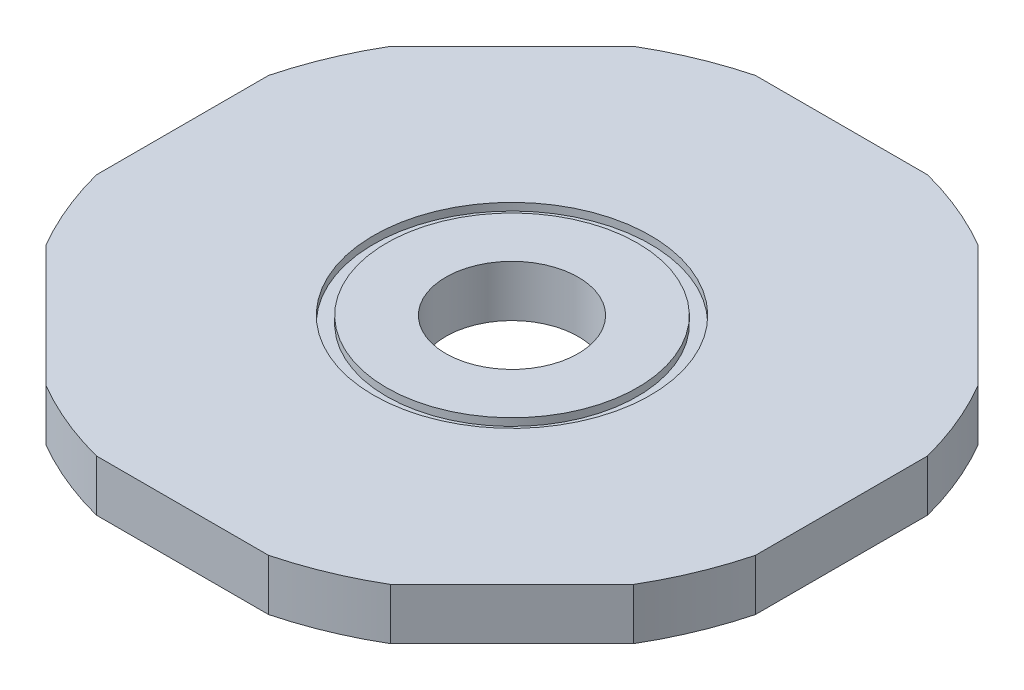
ISO-10303-21;
HEADER;
FILE_DESCRIPTION(('STEP AP214'),'2;1');
FILE_NAME('part.step','',(''),(''),'','','');
FILE_SCHEMA(('AUTOMOTIVE_DESIGN { 1 0 10303 214 1 1 1 1 }'));
ENDSEC;
DATA;
#1=APPLICATION_CONTEXT('core data for automotive mechanical design processes');
#2=APPLICATION_PROTOCOL_DEFINITION('international standard','automotive_design',2000,#1);
#3=PRODUCT_CONTEXT('',#1,'mechanical');
#4=PRODUCT('Part','Part','',(#3));
#5=PRODUCT_RELATED_PRODUCT_CATEGORY('part','',(#4));
#6=PRODUCT_DEFINITION_FORMATION('','',#4);
#7=PRODUCT_DEFINITION_CONTEXT('part definition',#1,'design');
#8=PRODUCT_DEFINITION('design','',#6,#7);
#9=PRODUCT_DEFINITION_SHAPE('','',#8);
#10=(LENGTH_UNIT() NAMED_UNIT(*) SI_UNIT(.MILLI.,.METRE.));
#11=(NAMED_UNIT(*) PLANE_ANGLE_UNIT() SI_UNIT($,.RADIAN.));
#12=(NAMED_UNIT(*) SI_UNIT($,.STERADIAN.) SOLID_ANGLE_UNIT());
#13=UNCERTAINTY_MEASURE_WITH_UNIT(LENGTH_MEASURE(1.E-05),#10,'distance_accuracy_value','');
#14=(GEOMETRIC_REPRESENTATION_CONTEXT(3) GLOBAL_UNCERTAINTY_ASSIGNED_CONTEXT((#13)) GLOBAL_UNIT_ASSIGNED_CONTEXT((#10,
#11,#12)) REPRESENTATION_CONTEXT('',''));
#15=CARTESIAN_POINT('',(0.,0.,0.));
#16=DIRECTION('',(0.,0.,1.));
#17=DIRECTION('',(1.,0.,0.));
#18=AXIS2_PLACEMENT_3D('',#15,#16,#17);
#19=CARTESIAN_POINT('',(0.,19.05,0.));
#20=DIRECTION('',(0.,1.,0.));
#21=DIRECTION('',(0.,0.,1.));
#22=AXIS2_PLACEMENT_3D('',#19,#20,#21);
#23=PLANE('',#22);
#24=CARTESIAN_POINT('',(0.,19.05,0.));
#25=DIRECTION('',(0.,1.,0.));
#26=DIRECTION('',(0.,0.,1.));
#27=AXIS2_PLACEMENT_3D('',#24,#25,#26);
#28=CIRCLE('',#27,24.5745);
#29=CARTESIAN_POINT('',(0.,19.05,24.5745));
#30=VERTEX_POINT('',#29);
#31=EDGE_CURVE('E336',#30,#30,#28,.T.);
#32=ORIENTED_EDGE('',*,*,#31,.F.);
#33=EDGE_LOOP('',(#32));
#34=FACE_BOUND('',#33,.T.);
#35=CARTESIAN_POINT('',(0.,19.05,0.));
#36=DIRECTION('',(0.,1.,0.));
#37=DIRECTION('',(0.,0.,1.));
#38=AXIS2_PLACEMENT_3D('',#35,#36,#37);
#39=CIRCLE('',#38,46.5455);
#40=CARTESIAN_POINT('',(0.,19.05,46.5455));
#41=VERTEX_POINT('',#40);
#42=EDGE_CURVE('E320',#41,#41,#39,.T.);
#43=ORIENTED_EDGE('',*,*,#42,.T.);
#44=EDGE_LOOP('',(#43));
#45=FACE_BOUND('',#44,.T.);
#46=ADVANCED_FACE('F49',(#34,#45),#23,.T.);
#47=CARTESIAN_POINT('',(0.,19.05,122.3));
#48=DIRECTION('',(0.,0.,-1.));
#49=DIRECTION('',(-1.,0.,0.));
#50=AXIS2_PLACEMENT_3D('',#47,#48,#49);
#51=PLANE('',#50);
#52=DIRECTION('',(1.,0.,0.));
#53=VECTOR('',#52,1.);
#54=CARTESIAN_POINT('',(0.,0.,122.3));
#55=LINE('',#54,#53);
#56=CARTESIAN_POINT('',(-31.9322720770069,0.,122.3));
#57=VERTEX_POINT('',#56);
#58=CARTESIAN_POINT('',(31.9322720770068,0.,122.3));
#59=VERTEX_POINT('',#58);
#60=EDGE_CURVE('E204',#57,#59,#55,.T.);
#61=ORIENTED_EDGE('',*,*,#60,.T.);
#62=DIRECTION('',(0.,-1.,0.));
#63=VECTOR('',#62,1.);
#64=CARTESIAN_POINT('',(31.9322720770068,19.05,122.3));
#65=LINE('',#64,#63);
#66=CARTESIAN_POINT('',(31.9322720770068,19.05,122.3));
#67=VERTEX_POINT('',#66);
#68=EDGE_CURVE('E11',#67,#59,#65,.T.);
#69=ORIENTED_EDGE('',*,*,#68,.F.);
#70=DIRECTION('',(1.,0.,0.));
#71=VECTOR('',#70,1.);
#72=CARTESIAN_POINT('',(0.,19.05,122.3));
#73=LINE('',#72,#71);
#74=CARTESIAN_POINT('',(-31.9322720770069,19.05,122.3));
#75=VERTEX_POINT('',#74);
#76=EDGE_CURVE('E346',#75,#67,#73,.T.);
#77=ORIENTED_EDGE('',*,*,#76,.F.);
#78=DIRECTION('',(0.,-1.,0.));
#79=VECTOR('',#78,1.);
#80=CARTESIAN_POINT('',(-31.9322720770069,19.05,122.3));
#81=LINE('',#80,#79);
#82=EDGE_CURVE('E200',#75,#57,#81,.T.);
#83=ORIENTED_EDGE('',*,*,#82,.T.);
#84=EDGE_LOOP('',(#61,#69,#77,#83));
#85=FACE_BOUND('',#84,.T.);
#86=ADVANCED_FACE('F51',(#85),#51,.F.);
#87=CARTESIAN_POINT('',(0.,19.05,0.));
#88=DIRECTION('',(0.,-1.,0.));
#89=DIRECTION('',(0.,0.,-1.));
#90=AXIS2_PLACEMENT_3D('',#87,#88,#89);
#91=CYLINDRICAL_SURFACE('',#90,126.4);
#92=CARTESIAN_POINT('',(0.,0.,0.));
#93=DIRECTION('',(0.,1.,0.));
#94=DIRECTION('',(0.,0.,1.));
#95=AXIS2_PLACEMENT_3D('',#92,#93,#94);
#96=CIRCLE('',#95,126.4);
#97=CARTESIAN_POINT('',(63.8996332147694,0.,109.05868546346));
#98=VERTEX_POINT('',#97);
#99=EDGE_CURVE('E208',#59,#98,#96,.T.);
#100=ORIENTED_EDGE('',*,*,#99,.T.);
#101=DIRECTION('',(0.,-1.,0.));
#102=VECTOR('',#101,1.);
#103=CARTESIAN_POINT('',(63.8996332147694,19.05,109.05868546346));
#104=LINE('',#103,#102);
#105=CARTESIAN_POINT('',(63.8996332147694,19.05,109.05868546346));
#106=VERTEX_POINT('',#105);
#107=EDGE_CURVE('E60',#106,#98,#104,.T.);
#108=ORIENTED_EDGE('',*,*,#107,.F.);
#109=CARTESIAN_POINT('',(0.,19.05,0.));
#110=DIRECTION('',(0.,1.,0.));
#111=DIRECTION('',(0.,0.,1.));
#112=AXIS2_PLACEMENT_3D('',#109,#110,#111);
#113=CIRCLE('',#112,126.4);
#114=EDGE_CURVE('E137',#67,#106,#113,.T.);
#115=ORIENTED_EDGE('',*,*,#114,.F.);
#116=ORIENTED_EDGE('',*,*,#68,.T.);
#117=EDGE_LOOP('',(#100,#108,#115,#116));
#118=FACE_BOUND('',#117,.T.);
#119=ADVANCED_FACE('F440',(#118),#91,.T.);
#120=CARTESIAN_POINT('',(86.4791593391148,19.05,86.4791593391148));
#121=DIRECTION('',(-0.707106781186548,0.,-0.707106781186548));
#122=DIRECTION('',(-0.707106781186548,0.,0.707106781186548));
#123=AXIS2_PLACEMENT_3D('',#120,#121,#122);
#124=PLANE('',#123);
#125=DIRECTION('',(0.707106781186548,0.,-0.707106781186548));
#126=VECTOR('',#125,1.);
#127=CARTESIAN_POINT('',(86.4791593391148,0.,86.4791593391148));
#128=LINE('',#127,#126);
#129=CARTESIAN_POINT('',(109.05868546346,0.,63.8996332147694));
#130=VERTEX_POINT('',#129);
#131=EDGE_CURVE('E212',#98,#130,#128,.T.);
#132=ORIENTED_EDGE('',*,*,#131,.T.);
#133=DIRECTION('',(0.,-1.,0.));
#134=VECTOR('',#133,1.);
#135=CARTESIAN_POINT('',(109.05868546346,19.05,63.8996332147694));
#136=LINE('',#135,#134);
#137=CARTESIAN_POINT('',(109.05868546346,19.05,63.8996332147694));
#138=VERTEX_POINT('',#137);
#139=EDGE_CURVE('E279',#138,#130,#136,.T.);
#140=ORIENTED_EDGE('',*,*,#139,.F.);
#141=DIRECTION('',(0.707106781186548,0.,-0.707106781186548));
#142=VECTOR('',#141,1.);
#143=CARTESIAN_POINT('',(86.4791593391148,19.05,86.4791593391148));
#144=LINE('',#143,#142);
#145=EDGE_CURVE('E350',#106,#138,#144,.T.);
#146=ORIENTED_EDGE('',*,*,#145,.F.);
#147=ORIENTED_EDGE('',*,*,#107,.T.);
#148=EDGE_LOOP('',(#132,#140,#146,#147));
#149=FACE_BOUND('',#148,.T.);
#150=ADVANCED_FACE('F450',(#149),#124,.F.);
#151=CARTESIAN_POINT('',(122.3,0.,31.9322720770069));
#152=VERTEX_POINT('',#151);
#153=EDGE_CURVE('E213',#130,#152,#96,.T.);
#154=ORIENTED_EDGE('',*,*,#153,.T.);
#155=DIRECTION('',(0.,-1.,0.));
#156=VECTOR('',#155,1.);
#157=CARTESIAN_POINT('',(122.3,19.05,31.9322720770069));
#158=LINE('',#157,#156);
#159=CARTESIAN_POINT('',(122.3,19.05,31.9322720770069));
#160=VERTEX_POINT('',#159);
#161=EDGE_CURVE('E275',#160,#152,#158,.T.);
#162=ORIENTED_EDGE('',*,*,#161,.F.);
#163=EDGE_CURVE('E351',#138,#160,#113,.T.);
#164=ORIENTED_EDGE('',*,*,#163,.F.);
#165=ORIENTED_EDGE('',*,*,#139,.T.);
#166=EDGE_LOOP('',(#154,#162,#164,#165));
#167=FACE_BOUND('',#166,.T.);
#168=ADVANCED_FACE('F387',(#167),#91,.T.);
#169=CARTESIAN_POINT('',(122.3,19.05,0.));
#170=DIRECTION('',(-1.,0.,0.));
#171=DIRECTION('',(0.,0.,1.));
#172=AXIS2_PLACEMENT_3D('',#169,#170,#171);
#173=PLANE('',#172);
#174=DIRECTION('',(0.,0.,-1.));
#175=VECTOR('',#174,1.);
#176=CARTESIAN_POINT('',(122.3,0.,0.));
#177=LINE('',#176,#175);
#178=CARTESIAN_POINT('',(122.3,0.,-31.9322720770068));
#179=VERTEX_POINT('',#178);
#180=EDGE_CURVE('E216',#152,#179,#177,.T.);
#181=ORIENTED_EDGE('',*,*,#180,.T.);
#182=DIRECTION('',(0.,-1.,0.));
#183=VECTOR('',#182,1.);
#184=CARTESIAN_POINT('',(122.3,19.05,-31.9322720770068));
#185=LINE('',#184,#183);
#186=CARTESIAN_POINT('',(122.3,19.05,-31.9322720770068));
#187=VERTEX_POINT('',#186);
#188=EDGE_CURVE('E271',#187,#179,#185,.T.);
#189=ORIENTED_EDGE('',*,*,#188,.F.);
#190=DIRECTION('',(0.,0.,-1.));
#191=VECTOR('',#190,1.);
#192=CARTESIAN_POINT('',(122.3,19.05,0.));
#193=LINE('',#192,#191);
#194=EDGE_CURVE('E354',#160,#187,#193,.T.);
#195=ORIENTED_EDGE('',*,*,#194,.F.);
#196=ORIENTED_EDGE('',*,*,#161,.T.);
#197=EDGE_LOOP('',(#181,#189,#195,#196));
#198=FACE_BOUND('',#197,.T.);
#199=ADVANCED_FACE('F391',(#198),#173,.F.);
#200=CARTESIAN_POINT('',(109.05868546346,0.,-63.8996332147692));
#201=VERTEX_POINT('',#200);
#202=EDGE_CURVE('E219',#179,#201,#96,.T.);
#203=ORIENTED_EDGE('',*,*,#202,.T.);
#204=DIRECTION('',(0.,-1.,0.));
#205=VECTOR('',#204,1.);
#206=CARTESIAN_POINT('',(109.05868546346,19.05,-63.8996332147692));
#207=LINE('',#206,#205);
#208=CARTESIAN_POINT('',(109.05868546346,19.05,-63.8996332147692));
#209=VERTEX_POINT('',#208);
#210=EDGE_CURVE('E267',#209,#201,#207,.T.);
#211=ORIENTED_EDGE('',*,*,#210,.F.);
#212=EDGE_CURVE('E357',#187,#209,#113,.T.);
#213=ORIENTED_EDGE('',*,*,#212,.F.);
#214=ORIENTED_EDGE('',*,*,#188,.T.);
#215=EDGE_LOOP('',(#203,#211,#213,#214));
#216=FACE_BOUND('',#215,.T.);
#217=ADVANCED_FACE('F394',(#216),#91,.T.);
#218=CARTESIAN_POINT('',(86.4791593391147,19.05,-86.4791593391147));
#219=DIRECTION('',(-0.707106781186548,0.,0.707106781186548));
#220=DIRECTION('',(0.707106781186548,0.,0.707106781186548));
#221=AXIS2_PLACEMENT_3D('',#218,#219,#220);
#222=PLANE('',#221);
#223=DIRECTION('',(-0.707106781186548,0.,-0.707106781186548));
#224=VECTOR('',#223,1.);
#225=CARTESIAN_POINT('',(86.4791593391147,0.,-86.4791593391147));
#226=LINE('',#225,#224);
#227=CARTESIAN_POINT('',(63.8996332147692,0.,-109.05868546346));
#228=VERTEX_POINT('',#227);
#229=EDGE_CURVE('E220',#201,#228,#226,.T.);
#230=ORIENTED_EDGE('',*,*,#229,.T.);
#231=DIRECTION('',(0.,-1.,0.));
#232=VECTOR('',#231,1.);
#233=CARTESIAN_POINT('',(63.8996332147692,19.05,-109.05868546346));
#234=LINE('',#233,#232);
#235=CARTESIAN_POINT('',(63.8996332147692,19.05,-109.05868546346));
#236=VERTEX_POINT('',#235);
#237=EDGE_CURVE('E263',#236,#228,#234,.T.);
#238=ORIENTED_EDGE('',*,*,#237,.F.);
#239=DIRECTION('',(-0.707106781186548,0.,-0.707106781186548));
#240=VECTOR('',#239,1.);
#241=CARTESIAN_POINT('',(86.4791593391147,19.05,-86.4791593391147));
#242=LINE('',#241,#240);
#243=EDGE_CURVE('E358',#209,#236,#242,.T.);
#244=ORIENTED_EDGE('',*,*,#243,.F.);
#245=ORIENTED_EDGE('',*,*,#210,.T.);
#246=EDGE_LOOP('',(#230,#238,#244,#245));
#247=FACE_BOUND('',#246,.T.);
#248=ADVANCED_FACE('F399',(#247),#222,.F.);
#249=CARTESIAN_POINT('',(31.932272077007,0.,-122.3));
#250=VERTEX_POINT('',#249);
#251=EDGE_CURVE('E223',#228,#250,#96,.T.);
#252=ORIENTED_EDGE('',*,*,#251,.T.);
#253=DIRECTION('',(0.,-1.,0.));
#254=VECTOR('',#253,1.);
#255=CARTESIAN_POINT('',(31.932272077007,19.05,-122.3));
#256=LINE('',#255,#254);
#257=CARTESIAN_POINT('',(31.932272077007,19.05,-122.3));
#258=VERTEX_POINT('',#257);
#259=EDGE_CURVE('E259',#258,#250,#256,.T.);
#260=ORIENTED_EDGE('',*,*,#259,.F.);
#261=EDGE_CURVE('E361',#236,#258,#113,.T.);
#262=ORIENTED_EDGE('',*,*,#261,.F.);
#263=ORIENTED_EDGE('',*,*,#237,.T.);
#264=EDGE_LOOP('',(#252,#260,#262,#263));
#265=FACE_BOUND('',#264,.T.);
#266=ADVANCED_FACE('F402',(#265),#91,.T.);
#267=CARTESIAN_POINT('',(0.,19.05,-122.3));
#268=DIRECTION('',(0.,0.,1.));
#269=DIRECTION('',(1.,0.,0.));
#270=AXIS2_PLACEMENT_3D('',#267,#268,#269);
#271=PLANE('',#270);
#272=DIRECTION('',(-1.,0.,0.));
#273=VECTOR('',#272,1.);
#274=CARTESIAN_POINT('',(0.,0.,-122.3));
#275=LINE('',#274,#273);
#276=CARTESIAN_POINT('',(-31.932272077007,0.,-122.3));
#277=VERTEX_POINT('',#276);
#278=EDGE_CURVE('E224',#250,#277,#275,.T.);
#279=ORIENTED_EDGE('',*,*,#278,.T.);
#280=DIRECTION('',(0.,-1.,0.));
#281=VECTOR('',#280,1.);
#282=CARTESIAN_POINT('',(-31.932272077007,19.05,-122.3));
#283=LINE('',#282,#281);
#284=CARTESIAN_POINT('',(-31.932272077007,19.05,-122.3));
#285=VERTEX_POINT('',#284);
#286=EDGE_CURVE('E255',#285,#277,#283,.T.);
#287=ORIENTED_EDGE('',*,*,#286,.F.);
#288=DIRECTION('',(-1.,0.,0.));
#289=VECTOR('',#288,1.);
#290=CARTESIAN_POINT('',(0.,19.05,-122.3));
#291=LINE('',#290,#289);
#292=EDGE_CURVE('E362',#258,#285,#291,.T.);
#293=ORIENTED_EDGE('',*,*,#292,.F.);
#294=ORIENTED_EDGE('',*,*,#259,.T.);
#295=EDGE_LOOP('',(#279,#287,#293,#294));
#296=FACE_BOUND('',#295,.T.);
#297=ADVANCED_FACE('F407',(#296),#271,.F.);
#298=CARTESIAN_POINT('',(-63.8996332147692,0.,-109.05868546346));
#299=VERTEX_POINT('',#298);
#300=EDGE_CURVE('E227',#277,#299,#96,.T.);
#301=ORIENTED_EDGE('',*,*,#300,.T.);
#302=DIRECTION('',(0.,-1.,0.));
#303=VECTOR('',#302,1.);
#304=CARTESIAN_POINT('',(-63.8996332147692,19.05,-109.05868546346));
#305=LINE('',#304,#303);
#306=CARTESIAN_POINT('',(-63.8996332147692,19.05,-109.05868546346));
#307=VERTEX_POINT('',#306);
#308=EDGE_CURVE('E251',#307,#299,#305,.T.);
#309=ORIENTED_EDGE('',*,*,#308,.F.);
#310=EDGE_CURVE('E364',#285,#307,#113,.T.);
#311=ORIENTED_EDGE('',*,*,#310,.F.);
#312=ORIENTED_EDGE('',*,*,#286,.T.);
#313=EDGE_LOOP('',(#301,#309,#311,#312));
#314=FACE_BOUND('',#313,.T.);
#315=ADVANCED_FACE('F410',(#314),#91,.T.);
#316=CARTESIAN_POINT('',(-86.4791593391147,19.05,-86.4791593391147));
#317=DIRECTION('',(0.707106781186548,0.,0.707106781186548));
#318=DIRECTION('',(0.707106781186548,0.,-0.707106781186548));
#319=AXIS2_PLACEMENT_3D('',#316,#317,#318);
#320=PLANE('',#319);
#321=DIRECTION('',(-0.707106781186548,0.,0.707106781186548));
#322=VECTOR('',#321,1.);
#323=CARTESIAN_POINT('',(-86.4791593391147,0.,-86.4791593391147));
#324=LINE('',#323,#322);
#325=CARTESIAN_POINT('',(-109.05868546346,0.,-63.8996332147692));
#326=VERTEX_POINT('',#325);
#327=EDGE_CURVE('E228',#299,#326,#324,.T.);
#328=ORIENTED_EDGE('',*,*,#327,.T.);
#329=DIRECTION('',(0.,-1.,0.));
#330=VECTOR('',#329,1.);
#331=CARTESIAN_POINT('',(-109.05868546346,19.05,-63.8996332147692));
#332=LINE('',#331,#330);
#333=CARTESIAN_POINT('',(-109.05868546346,19.05,-63.8996332147692));
#334=VERTEX_POINT('',#333);
#335=EDGE_CURVE('E247',#334,#326,#332,.T.);
#336=ORIENTED_EDGE('',*,*,#335,.F.);
#337=DIRECTION('',(-0.707106781186548,0.,0.707106781186548));
#338=VECTOR('',#337,1.);
#339=CARTESIAN_POINT('',(-86.4791593391147,19.05,-86.4791593391147));
#340=LINE('',#339,#338);
#341=EDGE_CURVE('E365',#307,#334,#340,.T.);
#342=ORIENTED_EDGE('',*,*,#341,.F.);
#343=ORIENTED_EDGE('',*,*,#308,.T.);
#344=EDGE_LOOP('',(#328,#336,#342,#343));
#345=FACE_BOUND('',#344,.T.);
#346=ADVANCED_FACE('F413',(#345),#320,.F.);
#347=CARTESIAN_POINT('',(-122.3,0.,-31.932272077007));
#348=VERTEX_POINT('',#347);
#349=EDGE_CURVE('E231',#326,#348,#96,.T.);
#350=ORIENTED_EDGE('',*,*,#349,.T.);
#351=DIRECTION('',(0.,-1.,0.));
#352=VECTOR('',#351,1.);
#353=CARTESIAN_POINT('',(-122.3,19.05,-31.932272077007));
#354=LINE('',#353,#352);
#355=CARTESIAN_POINT('',(-122.3,19.05,-31.932272077007));
#356=VERTEX_POINT('',#355);
#357=EDGE_CURVE('E243',#356,#348,#354,.T.);
#358=ORIENTED_EDGE('',*,*,#357,.F.);
#359=EDGE_CURVE('E187',#334,#356,#113,.T.);
#360=ORIENTED_EDGE('',*,*,#359,.F.);
#361=ORIENTED_EDGE('',*,*,#335,.T.);
#362=EDGE_LOOP('',(#350,#358,#360,#361));
#363=FACE_BOUND('',#362,.T.);
#364=ADVANCED_FACE('F418',(#363),#91,.T.);
#365=CARTESIAN_POINT('',(-122.3,19.05,0.));
#366=DIRECTION('',(1.,0.,0.));
#367=DIRECTION('',(0.,0.,-1.));
#368=AXIS2_PLACEMENT_3D('',#365,#366,#367);
#369=PLANE('',#368);
#370=DIRECTION('',(0.,0.,1.));
#371=VECTOR('',#370,1.);
#372=CARTESIAN_POINT('',(-122.3,0.,0.));
#373=LINE('',#372,#371);
#374=CARTESIAN_POINT('',(-122.3,0.,31.932272077007));
#375=VERTEX_POINT('',#374);
#376=EDGE_CURVE('E232',#348,#375,#373,.T.);
#377=ORIENTED_EDGE('',*,*,#376,.T.);
#378=DIRECTION('',(0.,-1.,0.));
#379=VECTOR('',#378,1.);
#380=CARTESIAN_POINT('',(-122.3,19.05,31.932272077007));
#381=LINE('',#380,#379);
#382=CARTESIAN_POINT('',(-122.3,19.05,31.932272077007));
#383=VERTEX_POINT('',#382);
#384=EDGE_CURVE('E193',#383,#375,#381,.T.);
#385=ORIENTED_EDGE('',*,*,#384,.F.);
#386=DIRECTION('',(0.,0.,1.));
#387=VECTOR('',#386,1.);
#388=CARTESIAN_POINT('',(-122.3,19.05,0.));
#389=LINE('',#388,#387);
#390=EDGE_CURVE('E181',#356,#383,#389,.T.);
#391=ORIENTED_EDGE('',*,*,#390,.F.);
#392=ORIENTED_EDGE('',*,*,#357,.T.);
#393=EDGE_LOOP('',(#377,#385,#391,#392));
#394=FACE_BOUND('',#393,.T.);
#395=ADVANCED_FACE('F421',(#394),#369,.F.);
#396=CARTESIAN_POINT('',(-109.05868546346,0.,63.8996332147692));
#397=VERTEX_POINT('',#396);
#398=EDGE_CURVE('E191',#375,#397,#96,.T.);
#399=ORIENTED_EDGE('',*,*,#398,.T.);
#400=DIRECTION('',(0.,-1.,0.));
#401=VECTOR('',#400,1.);
#402=CARTESIAN_POINT('',(-109.05868546346,19.05,63.8996332147692));
#403=LINE('',#402,#401);
#404=CARTESIAN_POINT('',(-109.05868546346,19.05,63.8996332147692));
#405=VERTEX_POINT('',#404);
#406=EDGE_CURVE('E188',#405,#397,#403,.T.);
#407=ORIENTED_EDGE('',*,*,#406,.F.);
#408=EDGE_CURVE('E175',#383,#405,#113,.T.);
#409=ORIENTED_EDGE('',*,*,#408,.F.);
#410=ORIENTED_EDGE('',*,*,#384,.T.);
#411=EDGE_LOOP('',(#399,#407,#409,#410));
#412=FACE_BOUND('',#411,.T.);
#413=ADVANCED_FACE('F189',(#412),#91,.T.);
#414=CARTESIAN_POINT('',(-86.4791593391147,19.05,86.4791593391147));
#415=DIRECTION('',(0.707106781186548,0.,-0.707106781186548));
#416=DIRECTION('',(-0.707106781186548,0.,-0.707106781186548));
#417=AXIS2_PLACEMENT_3D('',#414,#415,#416);
#418=PLANE('',#417);
#419=DIRECTION('',(0.707106781186548,0.,0.707106781186548));
#420=VECTOR('',#419,1.);
#421=CARTESIAN_POINT('',(-86.4791593391147,0.,86.4791593391147));
#422=LINE('',#421,#420);
#423=CARTESIAN_POINT('',(-63.8996332147692,0.,109.05868546346));
#424=VERTEX_POINT('',#423);
#425=EDGE_CURVE('E123',#397,#424,#422,.T.);
#426=ORIENTED_EDGE('',*,*,#425,.T.);
#427=DIRECTION('',(0.,-1.,0.));
#428=VECTOR('',#427,1.);
#429=CARTESIAN_POINT('',(-63.8996332147692,19.05,109.05868546346));
#430=LINE('',#429,#428);
#431=CARTESIAN_POINT('',(-63.8996332147692,19.05,109.05868546346));
#432=VERTEX_POINT('',#431);
#433=EDGE_CURVE('E194',#432,#424,#430,.T.);
#434=ORIENTED_EDGE('',*,*,#433,.F.);
#435=DIRECTION('',(0.707106781186548,0.,0.707106781186548));
#436=VECTOR('',#435,1.);
#437=CARTESIAN_POINT('',(-86.4791593391147,19.05,86.4791593391147));
#438=LINE('',#437,#436);
#439=EDGE_CURVE('E179',#405,#432,#438,.T.);
#440=ORIENTED_EDGE('',*,*,#439,.F.);
#441=ORIENTED_EDGE('',*,*,#406,.T.);
#442=EDGE_LOOP('',(#426,#434,#440,#441));
#443=FACE_BOUND('',#442,.T.);
#444=ADVANCED_FACE('F196',(#443),#418,.F.);
#445=EDGE_CURVE('E129',#424,#57,#96,.T.);
#446=ORIENTED_EDGE('',*,*,#445,.T.);
#447=ORIENTED_EDGE('',*,*,#82,.F.);
#448=EDGE_CURVE('E69',#432,#75,#113,.T.);
#449=ORIENTED_EDGE('',*,*,#448,.F.);
#450=ORIENTED_EDGE('',*,*,#433,.T.);
#451=EDGE_LOOP('',(#446,#447,#449,#450));
#452=FACE_BOUND('',#451,.T.);
#453=ADVANCED_FACE('F437',(#452),#91,.T.);
#454=CARTESIAN_POINT('',(0.,19.05,0.));
#455=DIRECTION('',(0.,1.,0.));
#456=DIRECTION('',(0.,0.,1.));
#457=AXIS2_PLACEMENT_3D('',#454,#455,#456);
#458=CIRCLE('',#457,51.3715);
#459=CARTESIAN_POINT('',(0.,19.05,51.3715));
#460=VERTEX_POINT('',#459);
#461=EDGE_CURVE('E328',#460,#460,#458,.T.);
#462=ORIENTED_EDGE('',*,*,#461,.F.);
#463=EDGE_LOOP('',(#462));
#464=FACE_BOUND('',#463,.T.);
#465=ORIENTED_EDGE('',*,*,#76,.T.);
#466=ORIENTED_EDGE('',*,*,#114,.T.);
#467=ORIENTED_EDGE('',*,*,#145,.T.);
#468=ORIENTED_EDGE('',*,*,#163,.T.);
#469=ORIENTED_EDGE('',*,*,#194,.T.);
#470=ORIENTED_EDGE('',*,*,#212,.T.);
#471=ORIENTED_EDGE('',*,*,#243,.T.);
#472=ORIENTED_EDGE('',*,*,#261,.T.);
#473=ORIENTED_EDGE('',*,*,#292,.T.);
#474=ORIENTED_EDGE('',*,*,#310,.T.);
#475=ORIENTED_EDGE('',*,*,#341,.T.);
#476=ORIENTED_EDGE('',*,*,#359,.T.);
#477=ORIENTED_EDGE('',*,*,#390,.T.);
#478=ORIENTED_EDGE('',*,*,#408,.T.);
#479=ORIENTED_EDGE('',*,*,#439,.T.);
#480=ORIENTED_EDGE('',*,*,#448,.T.);
#481=EDGE_LOOP('',(#465,#466,#467,#468,#469,#470,#471,#472,#473,#474,#475,#476,#477,#478,#479,#480));
#482=FACE_BOUND('',#481,.T.);
#483=ADVANCED_FACE('F177',(#464,#482),#23,.T.);
#484=CARTESIAN_POINT('',(0.,0.,0.));
#485=DIRECTION('',(0.,1.,0.));
#486=DIRECTION('',(0.,0.,1.));
#487=AXIS2_PLACEMENT_3D('',#484,#485,#486);
#488=PLANE('',#487);
#489=CARTESIAN_POINT('',(2.4920098907859E-13,0.,-71.374));
#490=DIRECTION('',(0.,-1.,0.));
#491=DIRECTION('',(1.,0.,0.));
#492=AXIS2_PLACEMENT_3D('',#489,#490,#491);
#493=CIRCLE('',#492,4.00000000000001);
#494=CARTESIAN_POINT('',(4.00000000000025,0.,-71.374));
#495=VERTEX_POINT('',#494);
#496=EDGE_CURVE('E472',#495,#495,#493,.T.);
#497=ORIENTED_EDGE('',*,*,#496,.F.);
#498=EDGE_LOOP('',(#497));
#499=FACE_BOUND('',#498,.T.);
#500=CARTESIAN_POINT('',(50.4690394004089,0.,-50.4690394004084));
#501=DIRECTION('',(0.,-1.,0.));
#502=DIRECTION('',(0.707106781186544,0.,0.707106781186551));
#503=AXIS2_PLACEMENT_3D('',#500,#501,#502);
#504=CIRCLE('',#503,4.00000000000001);
#505=CARTESIAN_POINT('',(53.2974665251551,0.,-47.6406122756622));
#506=VERTEX_POINT('',#505);
#507=EDGE_CURVE('E476',#506,#506,#504,.T.);
#508=ORIENTED_EDGE('',*,*,#507,.F.);
#509=EDGE_LOOP('',(#508));
#510=FACE_BOUND('',#509,.T.);
#511=CARTESIAN_POINT('',(50.4690394004082,0.,50.4690394004091));
#512=DIRECTION('',(0.,-1.,0.));
#513=DIRECTION('',(-0.707106781186554,0.,0.707106781186541));
#514=AXIS2_PLACEMENT_3D('',#511,#512,#513);
#515=CIRCLE('',#514,4.00000000000001);
#516=CARTESIAN_POINT('',(47.640612275662,0.,53.2974665251552));
#517=VERTEX_POINT('',#516);
#518=EDGE_CURVE('E305',#517,#517,#515,.T.);
#519=ORIENTED_EDGE('',*,*,#518,.F.);
#520=EDGE_LOOP('',(#519));
#521=FACE_BOUND('',#520,.T.);
#522=CARTESIAN_POINT('',(-7.47602967235769E-13,0.,71.374));
#523=DIRECTION('',(0.,-1.,0.));
#524=DIRECTION('',(-1.,0.,0.));
#525=AXIS2_PLACEMENT_3D('',#522,#523,#524);
#526=CIRCLE('',#525,4.00000000000001);
#527=CARTESIAN_POINT('',(-4.00000000000075,0.,71.374));
#528=VERTEX_POINT('',#527);
#529=EDGE_CURVE('E483',#528,#528,#526,.T.);
#530=ORIENTED_EDGE('',*,*,#529,.F.);
#531=EDGE_LOOP('',(#530));
#532=FACE_BOUND('',#531,.T.);
#533=CARTESIAN_POINT('',(-50.4690394004093,0.,50.469039400408));
#534=DIRECTION('',(0.,-1.,0.));
#535=DIRECTION('',(-0.707106781186539,0.,-0.707106781186556));
#536=AXIS2_PLACEMENT_3D('',#533,#534,#535);
#537=CIRCLE('',#536,4.00000000000001);
#538=CARTESIAN_POINT('',(-53.2974665251554,0.,47.6406122756618));
#539=VERTEX_POINT('',#538);
#540=EDGE_CURVE('E487',#539,#539,#537,.T.);
#541=ORIENTED_EDGE('',*,*,#540,.F.);
#542=EDGE_LOOP('',(#541));
#543=FACE_BOUND('',#542,.T.);
#544=CARTESIAN_POINT('',(-50.4690394004086,0.,-50.4690394004087));
#545=DIRECTION('',(0.,-1.,0.));
#546=DIRECTION('',(0.707106781186549,0.,-0.707106781186546));
#547=AXIS2_PLACEMENT_3D('',#544,#545,#546);
#548=CIRCLE('',#547,4.00000000000001);
#549=CARTESIAN_POINT('',(-47.6406122756624,0.,-53.2974665251549));
#550=VERTEX_POINT('',#549);
#551=EDGE_CURVE('E296',#550,#550,#548,.T.);
#552=ORIENTED_EDGE('',*,*,#551,.F.);
#553=EDGE_LOOP('',(#552));
#554=FACE_BOUND('',#553,.T.);
#555=CARTESIAN_POINT('',(71.374,0.,0.));
#556=DIRECTION('',(0.,-1.,0.));
#557=DIRECTION('',(0.,0.,-1.));
#558=AXIS2_PLACEMENT_3D('',#555,#556,#557);
#559=CIRCLE('',#558,4.025);
#560=CARTESIAN_POINT('',(71.374,0.,-4.025));
#561=VERTEX_POINT('',#560);
#562=EDGE_CURVE('E294',#561,#561,#559,.T.);
#563=ORIENTED_EDGE('',*,*,#562,.F.);
#564=EDGE_LOOP('',(#563));
#565=FACE_BOUND('',#564,.T.);
#566=CARTESIAN_POINT('',(-71.374,0.,0.));
#567=DIRECTION('',(0.,-1.,0.));
#568=DIRECTION('',(0.,0.,-1.));
#569=AXIS2_PLACEMENT_3D('',#566,#567,#568);
#570=CIRCLE('',#569,4.00000000000001);
#571=CARTESIAN_POINT('',(-71.374,0.,-4.00000000000001));
#572=VERTEX_POINT('',#571);
#573=EDGE_CURVE('E315',#572,#572,#570,.T.);
#574=ORIENTED_EDGE('',*,*,#573,.F.);
#575=EDGE_LOOP('',(#574));
#576=FACE_BOUND('',#575,.T.);
#577=CARTESIAN_POINT('',(0.,0.,0.));
#578=DIRECTION('',(0.,1.,0.));
#579=DIRECTION('',(0.,0.,1.));
#580=AXIS2_PLACEMENT_3D('',#577,#578,#579);
#581=CIRCLE('',#580,24.5745);
#582=CARTESIAN_POINT('',(0.,0.,24.5745));
#583=VERTEX_POINT('',#582);
#584=EDGE_CURVE('E209',#583,#583,#581,.T.);
#585=ORIENTED_EDGE('',*,*,#584,.T.);
#586=EDGE_LOOP('',(#585));
#587=FACE_BOUND('',#586,.T.);
#588=ORIENTED_EDGE('',*,*,#60,.F.);
#589=ORIENTED_EDGE('',*,*,#445,.F.);
#590=ORIENTED_EDGE('',*,*,#425,.F.);
#591=ORIENTED_EDGE('',*,*,#398,.F.);
#592=ORIENTED_EDGE('',*,*,#376,.F.);
#593=ORIENTED_EDGE('',*,*,#349,.F.);
#594=ORIENTED_EDGE('',*,*,#327,.F.);
#595=ORIENTED_EDGE('',*,*,#300,.F.);
#596=ORIENTED_EDGE('',*,*,#278,.F.);
#597=ORIENTED_EDGE('',*,*,#251,.F.);
#598=ORIENTED_EDGE('',*,*,#229,.F.);
#599=ORIENTED_EDGE('',*,*,#202,.F.);
#600=ORIENTED_EDGE('',*,*,#180,.F.);
#601=ORIENTED_EDGE('',*,*,#153,.F.);
#602=ORIENTED_EDGE('',*,*,#131,.F.);
#603=ORIENTED_EDGE('',*,*,#99,.F.);
#604=EDGE_LOOP('',(#588,#589,#590,#591,#592,#593,#594,#595,#596,#597,#598,#599,#600,#601,#602,#603));
#605=FACE_BOUND('',#604,.T.);
#606=ADVANCED_FACE('F425',(#499,#510,#521,#532,#543,#554,#565,#576,#587,#605),#488,.F.);
#607=CARTESIAN_POINT('',(0.,0.,0.));
#608=DIRECTION('',(0.,1.,0.));
#609=DIRECTION('',(0.,0.,1.));
#610=AXIS2_PLACEMENT_3D('',#607,#608,#609);
#611=CYLINDRICAL_SURFACE('',#610,24.5745);
#612=CARTESIAN_POINT('',(0.,0.,24.5745));
#613=CARTESIAN_POINT('',(0.,0.1984375,24.5745));
#614=CARTESIAN_POINT('',(0.,0.396875,24.5745));
#615=CARTESIAN_POINT('',(0.,0.79375,24.5745));
#616=CARTESIAN_POINT('',(0.,0.9921875,24.5745));
#617=CARTESIAN_POINT('',(0.,1.3890625,24.5745));
#618=CARTESIAN_POINT('',(0.,1.5875,24.5745));
#619=CARTESIAN_POINT('',(0.,1.984375,24.5745));
#620=CARTESIAN_POINT('',(0.,2.1828125,24.5745));
#621=CARTESIAN_POINT('',(0.,2.5796875,24.5745));
#622=CARTESIAN_POINT('',(0.,2.778125,24.5745));
#623=CARTESIAN_POINT('',(0.,3.175,24.5745));
#624=CARTESIAN_POINT('',(0.,3.3734375,24.5745));
#625=CARTESIAN_POINT('',(0.,3.7703125,24.5745));
#626=CARTESIAN_POINT('',(0.,3.96875,24.5745));
#627=CARTESIAN_POINT('',(0.,4.365625,24.5745));
#628=CARTESIAN_POINT('',(0.,4.5640625,24.5745));
#629=CARTESIAN_POINT('',(0.,4.9609375,24.5745));
#630=CARTESIAN_POINT('',(0.,5.159375,24.5745));
#631=CARTESIAN_POINT('',(0.,5.55625,24.5745));
#632=CARTESIAN_POINT('',(0.,5.7546875,24.5745));
#633=CARTESIAN_POINT('',(0.,6.1515625,24.5745));
#634=CARTESIAN_POINT('',(0.,6.35,24.5745));
#635=CARTESIAN_POINT('',(0.,6.746875,24.5745));
#636=CARTESIAN_POINT('',(0.,6.9453125,24.5745));
#637=CARTESIAN_POINT('',(0.,7.3421875,24.5745));
#638=CARTESIAN_POINT('',(0.,7.540625,24.5745));
#639=CARTESIAN_POINT('',(0.,7.9375,24.5745));
#640=CARTESIAN_POINT('',(0.,8.1359375,24.5745));
#641=CARTESIAN_POINT('',(0.,8.5328125,24.5745));
#642=CARTESIAN_POINT('',(0.,8.73125,24.5745));
#643=CARTESIAN_POINT('',(0.,9.128125,24.5745));
#644=CARTESIAN_POINT('',(0.,9.3265625,24.5745));
#645=CARTESIAN_POINT('',(0.,9.7234375,24.5745));
#646=CARTESIAN_POINT('',(0.,9.921875,24.5745));
#647=CARTESIAN_POINT('',(0.,10.31875,24.5745));
#648=CARTESIAN_POINT('',(0.,10.5171875,24.5745));
#649=CARTESIAN_POINT('',(0.,10.9140625,24.5745));
#650=CARTESIAN_POINT('',(0.,11.1125,24.5745));
#651=CARTESIAN_POINT('',(0.,11.509375,24.5745));
#652=CARTESIAN_POINT('',(0.,11.7078125,24.5745));
#653=CARTESIAN_POINT('',(0.,12.1046875,24.5745));
#654=CARTESIAN_POINT('',(0.,12.303125,24.5745));
#655=CARTESIAN_POINT('',(0.,12.7,24.5745));
#656=CARTESIAN_POINT('',(0.,12.8984375,24.5745));
#657=CARTESIAN_POINT('',(0.,13.2953125,24.5745));
#658=CARTESIAN_POINT('',(0.,13.49375,24.5745));
#659=CARTESIAN_POINT('',(0.,13.890625,24.5745));
#660=CARTESIAN_POINT('',(0.,14.0890625,24.5745));
#661=CARTESIAN_POINT('',(0.,14.4859375,24.5745));
#662=CARTESIAN_POINT('',(0.,14.684375,24.5745));
#663=CARTESIAN_POINT('',(0.,15.08125,24.5745));
#664=CARTESIAN_POINT('',(0.,15.2796875,24.5745));
#665=CARTESIAN_POINT('',(0.,15.6765625,24.5745));
#666=CARTESIAN_POINT('',(0.,15.875,24.5745));
#667=CARTESIAN_POINT('',(0.,16.271875,24.5745));
#668=CARTESIAN_POINT('',(0.,16.4703125,24.5745));
#669=CARTESIAN_POINT('',(0.,16.8671875,24.5745));
#670=CARTESIAN_POINT('',(0.,17.065625,24.5745));
#671=CARTESIAN_POINT('',(0.,17.4625,24.5745));
#672=CARTESIAN_POINT('',(0.,17.6609375,24.5745));
#673=CARTESIAN_POINT('',(0.,18.0578125,24.5745));
#674=CARTESIAN_POINT('',(0.,18.25625,24.5745));
#675=CARTESIAN_POINT('',(0.,18.653125,24.5745));
#676=CARTESIAN_POINT('',(0.,18.8515625,24.5745));
#677=CARTESIAN_POINT('',(0.,19.05,24.5745));
#678=B_SPLINE_CURVE_WITH_KNOTS('',3,(#612,#613,#614,#615,#616,#617,#618,#619,#620,#621,#622,
#623,#624,#625,#626,#627,#628,#629,#630,#631,#632,#633,#634,#635,#636,#637,#638,#639,#640,#641,
#642,#643,#644,#645,#646,#647,#648,#649,#650,#651,#652,#653,#654,#655,#656,#657,#658,#659,#660,
#661,#662,#663,#664,#665,#666,#667,#668,#669,#670,#671,#672,#673,#674,#675,#676,#677),
.UNSPECIFIED.,.F.,.F.,(4,2,2,2,2,2,2,2,2,2,2,2,2,2,2,2,2,2,2,2,2,2,2,2,2,2,2,2,2,2,2,2,4),(0.,
0.5953125,1.190625,1.7859375,2.38125,2.9765625,3.571875,4.1671875,4.7625,5.3578125,5.953125,
6.5484375,7.14375,7.7390625,8.334375,8.9296875,9.525,10.1203125,10.715625,11.3109375,11.90625,
12.5015625,13.096875,13.6921875,14.2875,14.8828125,15.478125,16.0734375,16.66875,17.2640625,
17.859375,18.4546875,19.05),.UNSPECIFIED.);
#679=EDGE_CURVE('BSEAM460',#583,#30,#678,.T.);
#680=ORIENTED_EDGE('',*,*,#584,.F.);
#681=ORIENTED_EDGE('',*,*,#31,.T.);
#682=ORIENTED_EDGE('',*,*,#679,.T.);
#683=ORIENTED_EDGE('',*,*,#679,.F.);
#684=EDGE_LOOP('',(#680,#682,#681,#683));
#685=FACE_BOUND('',#684,.T.);
#686=ADVANCED_FACE('F460',(#685),#611,.F.);
#687=CARTESIAN_POINT('',(0.,16.256,0.));
#688=DIRECTION('',(0.,1.,0.));
#689=DIRECTION('',(0.,0.,1.));
#690=AXIS2_PLACEMENT_3D('',#687,#688,#689);
#691=CYLINDRICAL_SURFACE('',#690,51.3715);
#692=CARTESIAN_POINT('',(0.,16.256,0.));
#693=DIRECTION('',(0.,1.,0.));
#694=DIRECTION('',(0.,0.,1.));
#695=AXIS2_PLACEMENT_3D('',#692,#693,#694);
#696=CIRCLE('',#695,51.3715);
#697=CARTESIAN_POINT('',(0.,16.256,51.3715));
#698=VERTEX_POINT('',#697);
#699=EDGE_CURVE('E332',#698,#698,#696,.T.);
#700=ORIENTED_EDGE('',*,*,#699,.F.);
#701=EDGE_LOOP('',(#700));
#702=FACE_BOUND('',#701,.T.);
#703=ORIENTED_EDGE('',*,*,#461,.T.);
#704=EDGE_LOOP('',(#703));
#705=FACE_BOUND('',#704,.T.);
#706=ADVANCED_FACE('F467',(#702,#705),#691,.F.);
#707=CARTESIAN_POINT('',(0.,16.256,0.));
#708=DIRECTION('',(0.,1.,0.));
#709=DIRECTION('',(0.,0.,1.));
#710=AXIS2_PLACEMENT_3D('',#707,#708,#709);
#711=PLANE('',#710);
#712=CARTESIAN_POINT('',(0.,16.256,0.));
#713=DIRECTION('',(0.,1.,0.));
#714=DIRECTION('',(0.,0.,1.));
#715=AXIS2_PLACEMENT_3D('',#712,#713,#714);
#716=CIRCLE('',#715,46.5455);
#717=CARTESIAN_POINT('',(0.,16.256,46.5455));
#718=VERTEX_POINT('',#717);
#719=EDGE_CURVE('E324',#718,#718,#716,.T.);
#720=ORIENTED_EDGE('',*,*,#719,.F.);
#721=EDGE_LOOP('',(#720));
#722=FACE_BOUND('',#721,.T.);
#723=ORIENTED_EDGE('',*,*,#699,.T.);
#724=EDGE_LOOP('',(#723));
#725=FACE_BOUND('',#724,.T.);
#726=ADVANCED_FACE('F510',(#722,#725),#711,.T.);
#727=CARTESIAN_POINT('',(0.,16.256,0.));
#728=DIRECTION('',(0.,1.,0.));
#729=DIRECTION('',(0.,0.,1.));
#730=AXIS2_PLACEMENT_3D('',#727,#728,#729);
#731=CYLINDRICAL_SURFACE('',#730,46.5455);
#732=ORIENTED_EDGE('',*,*,#719,.T.);
#733=EDGE_LOOP('',(#732));
#734=FACE_BOUND('',#733,.T.);
#735=ORIENTED_EDGE('',*,*,#42,.F.);
#736=EDGE_LOOP('',(#735));
#737=FACE_BOUND('',#736,.T.);
#738=ADVANCED_FACE('F500',(#734,#737),#731,.T.);
#739=CARTESIAN_POINT('',(-71.374,12.7,0.));
#740=DIRECTION('',(0.,-1.,0.));
#741=DIRECTION('',(0.,0.,-1.));
#742=AXIS2_PLACEMENT_3D('',#739,#740,#741);
#743=CYLINDRICAL_SURFACE('',#742,4.00000000000001);
#744=CARTESIAN_POINT('',(-71.374,12.7,0.));
#745=DIRECTION('',(0.,-1.,0.));
#746=DIRECTION('',(0.,0.,-1.));
#747=AXIS2_PLACEMENT_3D('',#744,#745,#746);
#748=CIRCLE('',#747,4.00000000000001);
#749=CARTESIAN_POINT('',(-71.374,12.7,-4.00000000000001));
#750=VERTEX_POINT('',#749);
#751=EDGE_CURVE('E316',#750,#750,#748,.T.);
#752=ORIENTED_EDGE('',*,*,#751,.F.);
#753=EDGE_LOOP('',(#752));
#754=FACE_BOUND('',#753,.T.);
#755=ORIENTED_EDGE('',*,*,#573,.T.);
#756=EDGE_LOOP('',(#755));
#757=FACE_BOUND('',#756,.T.);
#758=ADVANCED_FACE('F497',(#754,#757),#743,.F.);
#759=CARTESIAN_POINT('',(-71.374,12.7,0.));
#760=DIRECTION('',(0.,-1.,0.));
#761=DIRECTION('',(0.,0.,-1.));
#762=AXIS2_PLACEMENT_3D('',#759,#760,#761);
#763=PLANE('',#762);
#764=ORIENTED_EDGE('',*,*,#751,.T.);
#765=EDGE_LOOP('',(#764));
#766=FACE_BOUND('',#765,.T.);
#767=ADVANCED_FACE('F499',(#766),#763,.T.);
#768=CARTESIAN_POINT('',(71.374,0.,0.));
#769=DIRECTION('',(0.,-1.,0.));
#770=DIRECTION('',(0.,0.,-1.));
#771=AXIS2_PLACEMENT_3D('',#768,#769,#770);
#772=CONICAL_SURFACE('',#771,4.025,0.785398163397444);
#773=CARTESIAN_POINT('',(71.374,0.0249999999999931,0.));
#774=DIRECTION('',(0.,-1.,0.));
#775=DIRECTION('',(0.,0.,-1.));
#776=AXIS2_PLACEMENT_3D('',#773,#774,#775);
#777=CIRCLE('',#776,4.00000000000001);
#778=CARTESIAN_POINT('',(71.374,0.0249999999999931,-4.00000000000001));
#779=VERTEX_POINT('',#778);
#780=EDGE_CURVE('E285',#779,#779,#777,.F.);
#781=ORIENTED_EDGE('',*,*,#780,.T.);
#782=EDGE_LOOP('',(#781));
#783=FACE_BOUND('',#782,.T.);
#784=ORIENTED_EDGE('',*,*,#562,.T.);
#785=EDGE_LOOP('',(#784));
#786=FACE_BOUND('',#785,.T.);
#787=ADVANCED_FACE('F507',(#783,#786),#772,.F.);
#788=CARTESIAN_POINT('',(71.374,12.7,0.));
#789=DIRECTION('',(0.,-1.,0.));
#790=DIRECTION('',(0.,0.,1.));
#791=AXIS2_PLACEMENT_3D('',#788,#789,#790);
#792=PLANE('',#791);
#793=CARTESIAN_POINT('',(71.374,12.7,0.));
#794=DIRECTION('',(0.,-1.,0.));
#795=DIRECTION('',(0.,0.,1.));
#796=AXIS2_PLACEMENT_3D('',#793,#794,#795);
#797=CIRCLE('',#796,4.00000000000001);
#798=CARTESIAN_POINT('',(71.374,12.7,4.00000000000001));
#799=VERTEX_POINT('',#798);
#800=EDGE_CURVE('E773',#799,#799,#797,.T.);
#801=ORIENTED_EDGE('',*,*,#800,.T.);
#802=EDGE_LOOP('',(#801));
#803=FACE_BOUND('',#802,.T.);
#804=CARTESIAN_POINT('',(71.374,12.7,0.));
#805=DIRECTION('',(0.,-1.,0.));
#806=DIRECTION('',(0.,0.,-1.));
#807=AXIS2_PLACEMENT_3D('',#804,#805,#806);
#808=CIRCLE('',#807,3.4);
#809=CARTESIAN_POINT('',(71.374,12.7,-3.4));
#810=VERTEX_POINT('',#809);
#811=EDGE_CURVE('E53',#810,#810,#808,.F.);
#812=ORIENTED_EDGE('',*,*,#811,.T.);
#813=EDGE_LOOP('',(#812));
#814=FACE_BOUND('',#813,.T.);
#815=ADVANCED_FACE('F578',(#803,#814),#792,.T.);
#816=CARTESIAN_POINT('',(71.374,12.7,0.));
#817=DIRECTION('',(0.,-1.,0.));
#818=DIRECTION('',(0.,0.,-1.));
#819=AXIS2_PLACEMENT_3D('',#816,#817,#818);
#820=CYLINDRICAL_SURFACE('',#819,4.00000000000001);
#821=ORIENTED_EDGE('',*,*,#800,.F.);
#822=EDGE_LOOP('',(#821));
#823=FACE_BOUND('',#822,.T.);
#824=ORIENTED_EDGE('',*,*,#780,.F.);
#825=EDGE_LOOP('',(#824));
#826=FACE_BOUND('',#825,.T.);
#827=ADVANCED_FACE('F561',(#823,#826),#820,.F.);
#828=CARTESIAN_POINT('',(71.374,13.9570672953063,0.));
#829=DIRECTION('',(0.,-1.,0.));
#830=DIRECTION('',(0.,0.,-1.));
#831=AXIS2_PLACEMENT_3D('',#828,#829,#830);
#832=CONICAL_SURFACE('',#831,3.4,1.02974425867666);
#833=CARTESIAN_POINT('',(71.374,15.9999934,0.));
#834=VERTEX_POINT('',#833);
#835=VERTEX_LOOP('',#834);
#836=FACE_BOUND('',#835,.T.);
#837=CARTESIAN_POINT('',(71.374,13.9570672953063,0.));
#838=DIRECTION('',(0.,-1.,0.));
#839=DIRECTION('',(0.,0.,-1.));
#840=AXIS2_PLACEMENT_3D('',#837,#838,#839);
#841=CIRCLE('',#840,3.4);
#842=CARTESIAN_POINT('',(71.374,13.9570672953063,-3.4));
#843=VERTEX_POINT('',#842);
#844=EDGE_CURVE('E311',#843,#843,#841,.T.);
#845=ORIENTED_EDGE('',*,*,#844,.T.);
#846=EDGE_LOOP('',(#845));
#847=FACE_BOUND('',#846,.T.);
#848=ADVANCED_FACE('F557',(#836,#847),#832,.F.);
#849=CARTESIAN_POINT('',(71.374,0.,0.));
#850=DIRECTION('',(0.,-1.,0.));
#851=DIRECTION('',(0.,0.,-1.));
#852=AXIS2_PLACEMENT_3D('',#849,#850,#851);
#853=CYLINDRICAL_SURFACE('',#852,3.4);
#854=ORIENTED_EDGE('',*,*,#844,.F.);
#855=EDGE_LOOP('',(#854));
#856=FACE_BOUND('',#855,.T.);
#857=ORIENTED_EDGE('',*,*,#811,.F.);
#858=EDGE_LOOP('',(#857));
#859=FACE_BOUND('',#858,.T.);
#860=ADVANCED_FACE('F560',(#856,#859),#853,.F.);
#861=CARTESIAN_POINT('',(-50.4690394004086,12.7,-50.4690394004087));
#862=DIRECTION('',(0.,-1.,0.));
#863=DIRECTION('',(0.,0.,-1.));
#864=AXIS2_PLACEMENT_3D('',#861,#862,#863);
#865=CYLINDRICAL_SURFACE('',#864,4.00000000000001);
#866=CARTESIAN_POINT('',(-50.4690394004086,12.7,-50.4690394004087));
#867=DIRECTION('',(0.,-1.,0.));
#868=DIRECTION('',(0.707106781186549,0.,-0.707106781186546));
#869=AXIS2_PLACEMENT_3D('',#866,#867,#868);
#870=CIRCLE('',#869,4.00000000000001);
#871=CARTESIAN_POINT('',(-47.6406122756624,12.7,-53.2974665251549));
#872=VERTEX_POINT('',#871);
#873=EDGE_CURVE('E288',#872,#872,#870,.T.);
#874=ORIENTED_EDGE('',*,*,#873,.F.);
#875=EDGE_LOOP('',(#874));
#876=FACE_BOUND('',#875,.T.);
#877=ORIENTED_EDGE('',*,*,#551,.T.);
#878=EDGE_LOOP('',(#877));
#879=FACE_BOUND('',#878,.T.);
#880=ADVANCED_FACE('F610',(#876,#879),#865,.F.);
#881=CARTESIAN_POINT('',(-50.4690394004086,12.7,-50.4690394004087));
#882=DIRECTION('',(0.,-1.,0.));
#883=DIRECTION('',(0.707106781186549,0.,-0.707106781186546));
#884=AXIS2_PLACEMENT_3D('',#881,#882,#883);
#885=PLANE('',#884);
#886=ORIENTED_EDGE('',*,*,#873,.T.);
#887=EDGE_LOOP('',(#886));
#888=FACE_BOUND('',#887,.T.);
#889=ADVANCED_FACE('F619',(#888),#885,.T.);
#890=CARTESIAN_POINT('',(-50.4690394004093,12.7,50.469039400408));
#891=DIRECTION('',(0.,-1.,0.));
#892=DIRECTION('',(0.,0.,-1.));
#893=AXIS2_PLACEMENT_3D('',#890,#891,#892);
#894=CYLINDRICAL_SURFACE('',#893,4.00000000000001);
#895=CARTESIAN_POINT('',(-50.4690394004093,12.7,50.469039400408));
#896=DIRECTION('',(0.,-1.,0.));
#897=DIRECTION('',(-0.707106781186539,0.,-0.707106781186556));
#898=AXIS2_PLACEMENT_3D('',#895,#896,#897);
#899=CIRCLE('',#898,4.00000000000001);
#900=CARTESIAN_POINT('',(-53.2974665251554,12.7,47.6406122756618));
#901=VERTEX_POINT('',#900);
#902=EDGE_CURVE('E788',#901,#901,#899,.T.);
#903=ORIENTED_EDGE('',*,*,#902,.F.);
#904=EDGE_LOOP('',(#903));
#905=FACE_BOUND('',#904,.T.);
#906=ORIENTED_EDGE('',*,*,#540,.T.);
#907=EDGE_LOOP('',(#906));
#908=FACE_BOUND('',#907,.T.);
#909=ADVANCED_FACE('F630',(#905,#908),#894,.F.);
#910=CARTESIAN_POINT('',(-50.4690394004093,12.7,50.469039400408));
#911=DIRECTION('',(0.,-1.,0.));
#912=DIRECTION('',(-0.707106781186539,0.,-0.707106781186556));
#913=AXIS2_PLACEMENT_3D('',#910,#911,#912);
#914=PLANE('',#913);
#915=ORIENTED_EDGE('',*,*,#902,.T.);
#916=EDGE_LOOP('',(#915));
#917=FACE_BOUND('',#916,.T.);
#918=ADVANCED_FACE('F640',(#917),#914,.T.);
#919=CARTESIAN_POINT('',(-7.47602967235769E-13,12.7,71.374));
#920=DIRECTION('',(0.,-1.,0.));
#921=DIRECTION('',(0.,0.,-1.));
#922=AXIS2_PLACEMENT_3D('',#919,#920,#921);
#923=CYLINDRICAL_SURFACE('',#922,4.00000000000001);
#924=CARTESIAN_POINT('',(-7.47602967235769E-13,12.7,71.374));
#925=DIRECTION('',(0.,-1.,0.));
#926=DIRECTION('',(-1.,0.,0.));
#927=AXIS2_PLACEMENT_3D('',#924,#925,#926);
#928=CIRCLE('',#927,4.00000000000001);
#929=CARTESIAN_POINT('',(-4.00000000000075,12.7,71.374));
#930=VERTEX_POINT('',#929);
#931=EDGE_CURVE('E781',#930,#930,#928,.T.);
#932=ORIENTED_EDGE('',*,*,#931,.F.);
#933=EDGE_LOOP('',(#932));
#934=FACE_BOUND('',#933,.T.);
#935=ORIENTED_EDGE('',*,*,#529,.T.);
#936=EDGE_LOOP('',(#935));
#937=FACE_BOUND('',#936,.T.);
#938=ADVANCED_FACE('F651',(#934,#937),#923,.F.);
#939=CARTESIAN_POINT('',(-7.47602967235769E-13,12.7,71.374));
#940=DIRECTION('',(0.,-1.,0.));
#941=DIRECTION('',(-1.,0.,0.));
#942=AXIS2_PLACEMENT_3D('',#939,#940,#941);
#943=PLANE('',#942);
#944=ORIENTED_EDGE('',*,*,#931,.T.);
#945=EDGE_LOOP('',(#944));
#946=FACE_BOUND('',#945,.T.);
#947=ADVANCED_FACE('F662',(#946),#943,.T.);
#948=CARTESIAN_POINT('',(50.4690394004082,12.7,50.4690394004091));
#949=DIRECTION('',(0.,-1.,0.));
#950=DIRECTION('',(0.,0.,-1.));
#951=AXIS2_PLACEMENT_3D('',#948,#949,#950);
#952=CYLINDRICAL_SURFACE('',#951,4.00000000000001);
#953=CARTESIAN_POINT('',(50.4690394004082,12.7,50.4690394004091));
#954=DIRECTION('',(0.,-1.,0.));
#955=DIRECTION('',(-0.707106781186554,0.,0.707106781186541));
#956=AXIS2_PLACEMENT_3D('',#953,#954,#955);
#957=CIRCLE('',#956,4.00000000000001);
#958=CARTESIAN_POINT('',(47.640612275662,12.7,53.2974665251552));
#959=VERTEX_POINT('',#958);
#960=EDGE_CURVE('E776',#959,#959,#957,.T.);
#961=ORIENTED_EDGE('',*,*,#960,.F.);
#962=EDGE_LOOP('',(#961));
#963=FACE_BOUND('',#962,.T.);
#964=ORIENTED_EDGE('',*,*,#518,.T.);
#965=EDGE_LOOP('',(#964));
#966=FACE_BOUND('',#965,.T.);
#967=ADVANCED_FACE('F673',(#963,#966),#952,.F.);
#968=CARTESIAN_POINT('',(50.4690394004082,12.7,50.4690394004091));
#969=DIRECTION('',(0.,-1.,0.));
#970=DIRECTION('',(-0.707106781186554,0.,0.707106781186541));
#971=AXIS2_PLACEMENT_3D('',#968,#969,#970);
#972=PLANE('',#971);
#973=ORIENTED_EDGE('',*,*,#960,.T.);
#974=EDGE_LOOP('',(#973));
#975=FACE_BOUND('',#974,.T.);
#976=ADVANCED_FACE('F684',(#975),#972,.T.);
#977=CARTESIAN_POINT('',(50.4690394004089,12.7,-50.4690394004084));
#978=DIRECTION('',(0.,-1.,0.));
#979=DIRECTION('',(0.,0.,-1.));
#980=AXIS2_PLACEMENT_3D('',#977,#978,#979);
#981=CYLINDRICAL_SURFACE('',#980,4.00000000000001);
#982=CARTESIAN_POINT('',(50.4690394004089,12.7,-50.4690394004084));
#983=DIRECTION('',(0.,-1.,0.));
#984=DIRECTION('',(0.707106781186544,0.,0.707106781186551));
#985=AXIS2_PLACEMENT_3D('',#982,#983,#984);
#986=CIRCLE('',#985,4.00000000000001);
#987=CARTESIAN_POINT('',(53.2974665251551,12.7,-47.6406122756622));
#988=VERTEX_POINT('',#987);
#989=EDGE_CURVE('E763',#988,#988,#986,.T.);
#990=ORIENTED_EDGE('',*,*,#989,.F.);
#991=EDGE_LOOP('',(#990));
#992=FACE_BOUND('',#991,.T.);
#993=ORIENTED_EDGE('',*,*,#507,.T.);
#994=EDGE_LOOP('',(#993));
#995=FACE_BOUND('',#994,.T.);
#996=ADVANCED_FACE('F695',(#992,#995),#981,.F.);
#997=CARTESIAN_POINT('',(50.4690394004089,12.7,-50.4690394004084));
#998=DIRECTION('',(0.,-1.,0.));
#999=DIRECTION('',(0.707106781186544,0.,0.707106781186551));
#1000=AXIS2_PLACEMENT_3D('',#997,#998,#999);
#1001=PLANE('',#1000);
#1002=ORIENTED_EDGE('',*,*,#989,.T.);
#1003=EDGE_LOOP('',(#1002));
#1004=FACE_BOUND('',#1003,.T.);
#1005=ADVANCED_FACE('F706',(#1004),#1001,.T.);
#1006=CARTESIAN_POINT('',(2.4920098907859E-13,12.7,-71.374));
#1007=DIRECTION('',(0.,-1.,0.));
#1008=DIRECTION('',(0.,0.,-1.));
#1009=AXIS2_PLACEMENT_3D('',#1006,#1007,#1008);
#1010=CYLINDRICAL_SURFACE('',#1009,4.00000000000001);
#1011=CARTESIAN_POINT('',(2.4920098907859E-13,12.7,-71.374));
#1012=DIRECTION('',(0.,-1.,0.));
#1013=DIRECTION('',(1.,0.,0.));
#1014=AXIS2_PLACEMENT_3D('',#1011,#1012,#1013);
#1015=CIRCLE('',#1014,4.00000000000001);
#1016=CARTESIAN_POINT('',(4.00000000000025,12.7,-71.374));
#1017=VERTEX_POINT('',#1016);
#1018=EDGE_CURVE('E302',#1017,#1017,#1015,.T.);
#1019=ORIENTED_EDGE('',*,*,#1018,.F.);
#1020=EDGE_LOOP('',(#1019));
#1021=FACE_BOUND('',#1020,.T.);
#1022=ORIENTED_EDGE('',*,*,#496,.T.);
#1023=EDGE_LOOP('',(#1022));
#1024=FACE_BOUND('',#1023,.T.);
#1025=ADVANCED_FACE('F717',(#1021,#1024),#1010,.F.);
#1026=CARTESIAN_POINT('',(2.4920098907859E-13,12.7,-71.374));
#1027=DIRECTION('',(0.,-1.,0.));
#1028=DIRECTION('',(1.,0.,0.));
#1029=AXIS2_PLACEMENT_3D('',#1026,#1027,#1028);
#1030=PLANE('',#1029);
#1031=ORIENTED_EDGE('',*,*,#1018,.T.);
#1032=EDGE_LOOP('',(#1031));
#1033=FACE_BOUND('',#1032,.T.);
#1034=ADVANCED_FACE('F728',(#1033),#1030,.T.);
#1035=CLOSED_SHELL('',(#46,#86,#119,#150,#168,#199,#217,#248,#266,#297,#315,#346,#364,#395,#413,
#444,#453,#483,#606,#686,#706,#726,#738,#758,#767,#787,#815,#827,#848,#860,#880,#889,#909,#918,
#938,#947,#967,#976,#996,#1005,#1025,#1034));
#1036=MANIFOLD_SOLID_BREP('B2',#1035);
#1037=ADVANCED_BREP_SHAPE_REPRESENTATION('',(#18,#1036),#14);
#1038=SHAPE_DEFINITION_REPRESENTATION(#9,#1037);
ENDSEC;
END-ISO-10303-21;
